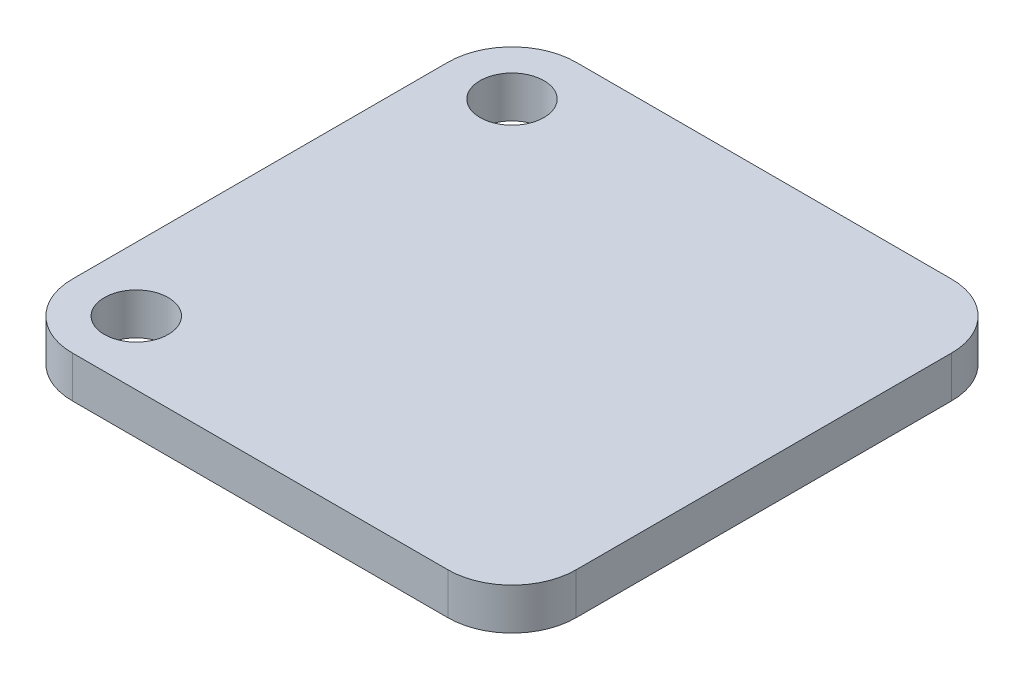
ISO-10303-21;
HEADER;
FILE_DESCRIPTION(('STEP AP214'),'2;1');
FILE_NAME('part.step','',(''),(''),'','','');
FILE_SCHEMA(('AUTOMOTIVE_DESIGN { 1 0 10303 214 1 1 1 1 }'));
ENDSEC;
DATA;
#1=APPLICATION_CONTEXT('core data for automotive mechanical design processes');
#2=APPLICATION_PROTOCOL_DEFINITION('international standard','automotive_design',2000,#1);
#3=PRODUCT_CONTEXT('',#1,'mechanical');
#4=PRODUCT('Part','Part','',(#3));
#5=PRODUCT_RELATED_PRODUCT_CATEGORY('part','',(#4));
#6=PRODUCT_DEFINITION_FORMATION('','',#4);
#7=PRODUCT_DEFINITION_CONTEXT('part definition',#1,'design');
#8=PRODUCT_DEFINITION('design','',#6,#7);
#9=PRODUCT_DEFINITION_SHAPE('','',#8);
#10=(LENGTH_UNIT() NAMED_UNIT(*) SI_UNIT(.MILLI.,.METRE.));
#11=(NAMED_UNIT(*) PLANE_ANGLE_UNIT() SI_UNIT($,.RADIAN.));
#12=(NAMED_UNIT(*) SI_UNIT($,.STERADIAN.) SOLID_ANGLE_UNIT());
#13=UNCERTAINTY_MEASURE_WITH_UNIT(LENGTH_MEASURE(1.E-05),#10,'distance_accuracy_value','');
#14=(GEOMETRIC_REPRESENTATION_CONTEXT(3) GLOBAL_UNCERTAINTY_ASSIGNED_CONTEXT((#13)) GLOBAL_UNIT_ASSIGNED_CONTEXT((#10,
#11,#12)) REPRESENTATION_CONTEXT('',''));
#15=CARTESIAN_POINT('',(0.,0.,0.));
#16=DIRECTION('',(0.,0.,1.));
#17=DIRECTION('',(1.,0.,0.));
#18=AXIS2_PLACEMENT_3D('',#15,#16,#17);
#19=CARTESIAN_POINT('',(-10.,1.65,-9.99999999999999));
#20=DIRECTION('',(1.,0.,0.));
#21=DIRECTION('',(0.,0.,-1.));
#22=AXIS2_PLACEMENT_3D('',#19,#20,#21);
#23=PLANE('',#22);
#24=DIRECTION('',(0.,0.,1.));
#25=VECTOR('',#24,1.);
#26=CARTESIAN_POINT('',(-10.,1.65,-9.99999999999999));
#27=LINE('',#26,#25);
#28=CARTESIAN_POINT('',(-10.,1.65,-7.45999999999999));
#29=VERTEX_POINT('',#28);
#30=CARTESIAN_POINT('',(-10.,1.65,7.46));
#31=VERTEX_POINT('',#30);
#32=EDGE_CURVE('E118',#29,#31,#27,.T.);
#33=ORIENTED_EDGE('',*,*,#32,.F.);
#34=DIRECTION('',(0.,-1.,0.));
#35=VECTOR('',#34,1.);
#36=CARTESIAN_POINT('',(-10.,1.65,-7.45999999999999));
#37=LINE('',#36,#35);
#38=CARTESIAN_POINT('',(-10.,0.,-7.45999999999999));
#39=VERTEX_POINT('',#38);
#40=EDGE_CURVE('E103',#29,#39,#37,.T.);
#41=ORIENTED_EDGE('',*,*,#40,.T.);
#42=DIRECTION('',(0.,0.,1.));
#43=VECTOR('',#42,1.);
#44=CARTESIAN_POINT('',(-10.,0.,-9.99999999999999));
#45=LINE('',#44,#43);
#46=CARTESIAN_POINT('',(-10.,0.,7.46));
#47=VERTEX_POINT('',#46);
#48=EDGE_CURVE('E115',#39,#47,#45,.T.);
#49=ORIENTED_EDGE('',*,*,#48,.T.);
#50=DIRECTION('',(0.,-1.,0.));
#51=VECTOR('',#50,1.);
#52=CARTESIAN_POINT('',(-10.,1.65,7.46));
#53=LINE('',#52,#51);
#54=EDGE_CURVE('E120',#47,#31,#53,.F.);
#55=ORIENTED_EDGE('',*,*,#54,.T.);
#56=EDGE_LOOP('',(#33,#41,#49,#55));
#57=FACE_BOUND('',#56,.T.);
#58=ADVANCED_FACE('F32',(#57),#23,.F.);
#59=CARTESIAN_POINT('',(10.,1.65,10.));
#60=DIRECTION('',(0.,0.,-1.));
#61=DIRECTION('',(-1.,0.,0.));
#62=AXIS2_PLACEMENT_3D('',#59,#60,#61);
#63=PLANE('',#62);
#64=DIRECTION('',(1.,0.,0.));
#65=VECTOR('',#64,1.);
#66=CARTESIAN_POINT('',(10.,1.65,10.));
#67=LINE('',#66,#65);
#68=CARTESIAN_POINT('',(-7.46,1.65,10.));
#69=VERTEX_POINT('',#68);
#70=CARTESIAN_POINT('',(7.46,1.65,10.));
#71=VERTEX_POINT('',#70);
#72=EDGE_CURVE('E162',#69,#71,#67,.T.);
#73=ORIENTED_EDGE('',*,*,#72,.F.);
#74=DIRECTION('',(0.,-1.,0.));
#75=VECTOR('',#74,1.);
#76=CARTESIAN_POINT('',(-7.46,1.65,10.));
#77=LINE('',#76,#75);
#78=CARTESIAN_POINT('',(-7.46,0.,10.));
#79=VERTEX_POINT('',#78);
#80=EDGE_CURVE('E11',#69,#79,#77,.T.);
#81=ORIENTED_EDGE('',*,*,#80,.T.);
#82=DIRECTION('',(1.,0.,0.));
#83=VECTOR('',#82,1.);
#84=CARTESIAN_POINT('',(10.,0.,10.));
#85=LINE('',#84,#83);
#86=CARTESIAN_POINT('',(7.46,0.,10.));
#87=VERTEX_POINT('',#86);
#88=EDGE_CURVE('E125',#79,#87,#85,.T.);
#89=ORIENTED_EDGE('',*,*,#88,.T.);
#90=DIRECTION('',(0.,-1.,0.));
#91=VECTOR('',#90,1.);
#92=CARTESIAN_POINT('',(7.46,1.65,10.));
#93=LINE('',#92,#91);
#94=EDGE_CURVE('E40',#87,#71,#93,.F.);
#95=ORIENTED_EDGE('',*,*,#94,.T.);
#96=EDGE_LOOP('',(#73,#81,#89,#95));
#97=FACE_BOUND('',#96,.T.);
#98=ADVANCED_FACE('F161',(#97),#63,.F.);
#99=CARTESIAN_POINT('',(10.,1.65,-10.));
#100=DIRECTION('',(-1.,0.,0.));
#101=DIRECTION('',(0.,0.,1.));
#102=AXIS2_PLACEMENT_3D('',#99,#100,#101);
#103=PLANE('',#102);
#104=DIRECTION('',(0.,0.,-1.));
#105=VECTOR('',#104,1.);
#106=CARTESIAN_POINT('',(10.,0.,-10.));
#107=LINE('',#106,#105);
#108=CARTESIAN_POINT('',(10.,0.,7.46));
#109=VERTEX_POINT('',#108);
#110=CARTESIAN_POINT('',(10.,0.,-7.46));
#111=VERTEX_POINT('',#110);
#112=EDGE_CURVE('E129',#109,#111,#107,.T.);
#113=ORIENTED_EDGE('',*,*,#112,.T.);
#114=DIRECTION('',(0.,-1.,0.));
#115=VECTOR('',#114,1.);
#116=CARTESIAN_POINT('',(10.,1.65,-7.46));
#117=LINE('',#116,#115);
#118=CARTESIAN_POINT('',(10.,1.65,-7.46));
#119=VERTEX_POINT('',#118);
#120=EDGE_CURVE('E47',#111,#119,#117,.F.);
#121=ORIENTED_EDGE('',*,*,#120,.T.);
#122=DIRECTION('',(0.,0.,-1.));
#123=VECTOR('',#122,1.);
#124=CARTESIAN_POINT('',(10.,1.65,-10.));
#125=LINE('',#124,#123);
#126=CARTESIAN_POINT('',(10.,1.65,7.46));
#127=VERTEX_POINT('',#126);
#128=EDGE_CURVE('E168',#127,#119,#125,.T.);
#129=ORIENTED_EDGE('',*,*,#128,.F.);
#130=DIRECTION('',(0.,-1.,0.));
#131=VECTOR('',#130,1.);
#132=CARTESIAN_POINT('',(10.,1.65,7.46));
#133=LINE('',#132,#131);
#134=EDGE_CURVE('E155',#127,#109,#133,.T.);
#135=ORIENTED_EDGE('',*,*,#134,.T.);
#136=EDGE_LOOP('',(#113,#121,#129,#135));
#137=FACE_BOUND('',#136,.T.);
#138=ADVANCED_FACE('F172',(#137),#103,.F.);
#139=CARTESIAN_POINT('',(10.,1.65,-10.));
#140=DIRECTION('',(0.,0.,1.));
#141=DIRECTION('',(1.,0.,0.));
#142=AXIS2_PLACEMENT_3D('',#139,#140,#141);
#143=PLANE('',#142);
#144=DIRECTION('',(-1.,0.,0.));
#145=VECTOR('',#144,1.);
#146=CARTESIAN_POINT('',(10.,0.,-10.));
#147=LINE('',#146,#145);
#148=CARTESIAN_POINT('',(7.46,0.,-10.));
#149=VERTEX_POINT('',#148);
#150=CARTESIAN_POINT('',(-7.46,0.,-9.99999999999999));
#151=VERTEX_POINT('',#150);
#152=EDGE_CURVE('E139',#149,#151,#147,.T.);
#153=ORIENTED_EDGE('',*,*,#152,.T.);
#154=DIRECTION('',(0.,-1.,0.));
#155=VECTOR('',#154,1.);
#156=CARTESIAN_POINT('',(-7.46,1.65,-9.99999999999999));
#157=LINE('',#156,#155);
#158=CARTESIAN_POINT('',(-7.46,1.65,-9.99999999999999));
#159=VERTEX_POINT('',#158);
#160=EDGE_CURVE('E104',#151,#159,#157,.F.);
#161=ORIENTED_EDGE('',*,*,#160,.T.);
#162=DIRECTION('',(-1.,0.,0.));
#163=VECTOR('',#162,1.);
#164=CARTESIAN_POINT('',(10.,1.65,-10.));
#165=LINE('',#164,#163);
#166=CARTESIAN_POINT('',(7.46,1.65,-10.));
#167=VERTEX_POINT('',#166);
#168=EDGE_CURVE('E135',#167,#159,#165,.T.);
#169=ORIENTED_EDGE('',*,*,#168,.F.);
#170=DIRECTION('',(0.,-1.,0.));
#171=VECTOR('',#170,1.);
#172=CARTESIAN_POINT('',(7.46,1.65,-10.));
#173=LINE('',#172,#171);
#174=EDGE_CURVE('E109',#167,#149,#173,.T.);
#175=ORIENTED_EDGE('',*,*,#174,.T.);
#176=EDGE_LOOP('',(#153,#161,#169,#175));
#177=FACE_BOUND('',#176,.T.);
#178=ADVANCED_FACE('F179',(#177),#143,.F.);
#179=CARTESIAN_POINT('',(0.,1.65,0.));
#180=DIRECTION('',(0.,-1.,0.));
#181=DIRECTION('',(0.,0.,-1.));
#182=AXIS2_PLACEMENT_3D('',#179,#180,#181);
#183=PLANE('',#182);
#184=CARTESIAN_POINT('',(-7.46,1.65,7.46));
#185=DIRECTION('',(0.,1.,0.));
#186=DIRECTION('',(0.,0.,1.));
#187=AXIS2_PLACEMENT_3D('',#184,#185,#186);
#188=CIRCLE('',#187,1.27);
#189=CARTESIAN_POINT('',(-7.46,1.65,8.73000000000001));
#190=VERTEX_POINT('',#189);
#191=EDGE_CURVE('E185',#190,#190,#188,.T.);
#192=ORIENTED_EDGE('',*,*,#191,.F.);
#193=EDGE_LOOP('',(#192));
#194=FACE_BOUND('',#193,.T.);
#195=CARTESIAN_POINT('',(-7.46,1.65,-7.45999999999999));
#196=DIRECTION('',(0.,1.,0.));
#197=DIRECTION('',(0.,0.,1.));
#198=AXIS2_PLACEMENT_3D('',#195,#196,#197);
#199=CIRCLE('',#198,1.27);
#200=CARTESIAN_POINT('',(-7.46,1.65,-6.18999999999999));
#201=VERTEX_POINT('',#200);
#202=EDGE_CURVE('E132',#201,#201,#199,.T.);
#203=ORIENTED_EDGE('',*,*,#202,.F.);
#204=EDGE_LOOP('',(#203));
#205=FACE_BOUND('',#204,.T.);
#206=ORIENTED_EDGE('',*,*,#168,.T.);
#207=CARTESIAN_POINT('',(-7.46,1.65,-7.45999999999999));
#208=DIRECTION('',(0.,-1.,0.));
#209=DIRECTION('',(0.,0.,-1.));
#210=AXIS2_PLACEMENT_3D('',#207,#208,#209);
#211=CIRCLE('',#210,2.54);
#212=EDGE_CURVE('E153',#159,#29,#211,.F.);
#213=ORIENTED_EDGE('',*,*,#212,.T.);
#214=ORIENTED_EDGE('',*,*,#32,.T.);
#215=CARTESIAN_POINT('',(-7.46,1.65,7.46));
#216=DIRECTION('',(0.,-1.,0.));
#217=DIRECTION('',(0.,0.,-1.));
#218=AXIS2_PLACEMENT_3D('',#215,#216,#217);
#219=CIRCLE('',#218,2.54);
#220=EDGE_CURVE('E149',#31,#69,#219,.F.);
#221=ORIENTED_EDGE('',*,*,#220,.T.);
#222=ORIENTED_EDGE('',*,*,#72,.T.);
#223=CARTESIAN_POINT('',(7.46,1.65,7.46));
#224=DIRECTION('',(0.,-1.,0.));
#225=DIRECTION('',(0.,0.,-1.));
#226=AXIS2_PLACEMENT_3D('',#223,#224,#225);
#227=CIRCLE('',#226,2.54);
#228=EDGE_CURVE('E54',#71,#127,#227,.F.);
#229=ORIENTED_EDGE('',*,*,#228,.T.);
#230=ORIENTED_EDGE('',*,*,#128,.T.);
#231=CARTESIAN_POINT('',(7.46,1.65,-7.46));
#232=DIRECTION('',(0.,-1.,0.));
#233=DIRECTION('',(0.,0.,-1.));
#234=AXIS2_PLACEMENT_3D('',#231,#232,#233);
#235=CIRCLE('',#234,2.54);
#236=EDGE_CURVE('E151',#119,#167,#235,.F.);
#237=ORIENTED_EDGE('',*,*,#236,.T.);
#238=EDGE_LOOP('',(#206,#213,#214,#221,#222,#229,#230,#237));
#239=FACE_BOUND('',#238,.T.);
#240=ADVANCED_FACE('F166',(#194,#205,#239),#183,.F.);
#241=CARTESIAN_POINT('',(0.,0.,0.));
#242=DIRECTION('',(0.,-1.,0.));
#243=DIRECTION('',(0.,0.,-1.));
#244=AXIS2_PLACEMENT_3D('',#241,#242,#243);
#245=PLANE('',#244);
#246=CARTESIAN_POINT('',(-7.46,0.,7.46));
#247=DIRECTION('',(0.,1.,0.));
#248=DIRECTION('',(0.,0.,1.));
#249=AXIS2_PLACEMENT_3D('',#246,#247,#248);
#250=CIRCLE('',#249,1.27);
#251=CARTESIAN_POINT('',(-7.46,0.,8.73000000000001));
#252=VERTEX_POINT('',#251);
#253=EDGE_CURVE('E183',#252,#252,#250,.T.);
#254=ORIENTED_EDGE('',*,*,#253,.T.);
#255=EDGE_LOOP('',(#254));
#256=FACE_BOUND('',#255,.T.);
#257=CARTESIAN_POINT('',(-7.46,0.,-7.45999999999999));
#258=DIRECTION('',(0.,1.,0.));
#259=DIRECTION('',(0.,0.,1.));
#260=AXIS2_PLACEMENT_3D('',#257,#258,#259);
#261=CIRCLE('',#260,1.27);
#262=CARTESIAN_POINT('',(-7.46,0.,-6.18999999999999));
#263=VERTEX_POINT('',#262);
#264=EDGE_CURVE('E126',#263,#263,#261,.T.);
#265=ORIENTED_EDGE('',*,*,#264,.T.);
#266=EDGE_LOOP('',(#265));
#267=FACE_BOUND('',#266,.T.);
#268=ORIENTED_EDGE('',*,*,#48,.F.);
#269=CARTESIAN_POINT('',(-7.46,0.,-7.45999999999999));
#270=DIRECTION('',(0.,-1.,0.));
#271=DIRECTION('',(0.,0.,-1.));
#272=AXIS2_PLACEMENT_3D('',#269,#270,#271);
#273=CIRCLE('',#272,2.54);
#274=EDGE_CURVE('E99',#39,#151,#273,.T.);
#275=ORIENTED_EDGE('',*,*,#274,.T.);
#276=ORIENTED_EDGE('',*,*,#152,.F.);
#277=CARTESIAN_POINT('',(7.46,0.,-7.46));
#278=DIRECTION('',(0.,-1.,0.));
#279=DIRECTION('',(0.,0.,-1.));
#280=AXIS2_PLACEMENT_3D('',#277,#278,#279);
#281=CIRCLE('',#280,2.54);
#282=EDGE_CURVE('E110',#149,#111,#281,.T.);
#283=ORIENTED_EDGE('',*,*,#282,.T.);
#284=ORIENTED_EDGE('',*,*,#112,.F.);
#285=CARTESIAN_POINT('',(7.46,0.,7.46));
#286=DIRECTION('',(0.,-1.,0.));
#287=DIRECTION('',(0.,0.,-1.));
#288=AXIS2_PLACEMENT_3D('',#285,#286,#287);
#289=CIRCLE('',#288,2.54);
#290=EDGE_CURVE('E119',#109,#87,#289,.T.);
#291=ORIENTED_EDGE('',*,*,#290,.T.);
#292=ORIENTED_EDGE('',*,*,#88,.F.);
#293=CARTESIAN_POINT('',(-7.46,0.,7.46));
#294=DIRECTION('',(0.,-1.,0.));
#295=DIRECTION('',(0.,0.,-1.));
#296=AXIS2_PLACEMENT_3D('',#293,#294,#295);
#297=CIRCLE('',#296,2.54);
#298=EDGE_CURVE('E124',#79,#47,#297,.T.);
#299=ORIENTED_EDGE('',*,*,#298,.T.);
#300=EDGE_LOOP('',(#268,#275,#276,#283,#284,#291,#292,#299));
#301=FACE_BOUND('',#300,.T.);
#302=ADVANCED_FACE('F122',(#256,#267,#301),#245,.T.);
#303=CARTESIAN_POINT('',(-7.46,1.65,-7.45999999999999));
#304=DIRECTION('',(0.,-1.,0.));
#305=DIRECTION('',(0.,0.,-1.));
#306=AXIS2_PLACEMENT_3D('',#303,#304,#305);
#307=CYLINDRICAL_SURFACE('',#306,2.54);
#308=ORIENTED_EDGE('',*,*,#212,.F.);
#309=ORIENTED_EDGE('',*,*,#160,.F.);
#310=ORIENTED_EDGE('',*,*,#274,.F.);
#311=ORIENTED_EDGE('',*,*,#40,.F.);
#312=EDGE_LOOP('',(#308,#309,#310,#311));
#313=FACE_BOUND('',#312,.T.);
#314=ADVANCED_FACE('F102',(#313),#307,.T.);
#315=CARTESIAN_POINT('',(7.46,1.65,-7.46));
#316=DIRECTION('',(0.,-1.,0.));
#317=DIRECTION('',(0.,0.,-1.));
#318=AXIS2_PLACEMENT_3D('',#315,#316,#317);
#319=CYLINDRICAL_SURFACE('',#318,2.54);
#320=ORIENTED_EDGE('',*,*,#236,.F.);
#321=ORIENTED_EDGE('',*,*,#120,.F.);
#322=ORIENTED_EDGE('',*,*,#282,.F.);
#323=ORIENTED_EDGE('',*,*,#174,.F.);
#324=EDGE_LOOP('',(#320,#321,#322,#323));
#325=FACE_BOUND('',#324,.T.);
#326=ADVANCED_FACE('F176',(#325),#319,.T.);
#327=CARTESIAN_POINT('',(-7.46,1.65,7.46));
#328=DIRECTION('',(0.,-1.,0.));
#329=DIRECTION('',(0.,0.,-1.));
#330=AXIS2_PLACEMENT_3D('',#327,#328,#329);
#331=CYLINDRICAL_SURFACE('',#330,2.54);
#332=ORIENTED_EDGE('',*,*,#220,.F.);
#333=ORIENTED_EDGE('',*,*,#54,.F.);
#334=ORIENTED_EDGE('',*,*,#298,.F.);
#335=ORIENTED_EDGE('',*,*,#80,.F.);
#336=EDGE_LOOP('',(#332,#333,#334,#335));
#337=FACE_BOUND('',#336,.T.);
#338=ADVANCED_FACE('F211',(#337),#331,.T.);
#339=CARTESIAN_POINT('',(7.46,1.65,7.46));
#340=DIRECTION('',(0.,-1.,0.));
#341=DIRECTION('',(0.,0.,-1.));
#342=AXIS2_PLACEMENT_3D('',#339,#340,#341);
#343=CYLINDRICAL_SURFACE('',#342,2.54);
#344=ORIENTED_EDGE('',*,*,#228,.F.);
#345=ORIENTED_EDGE('',*,*,#94,.F.);
#346=ORIENTED_EDGE('',*,*,#290,.F.);
#347=ORIENTED_EDGE('',*,*,#134,.F.);
#348=EDGE_LOOP('',(#344,#345,#346,#347));
#349=FACE_BOUND('',#348,.T.);
#350=ADVANCED_FACE('F34',(#349),#343,.T.);
#351=CARTESIAN_POINT('',(-7.46,0.,-7.45999999999999));
#352=DIRECTION('',(0.,1.,0.));
#353=DIRECTION('',(0.,0.,1.));
#354=AXIS2_PLACEMENT_3D('',#351,#352,#353);
#355=CYLINDRICAL_SURFACE('',#354,1.27);
#356=ORIENTED_EDGE('',*,*,#264,.F.);
#357=EDGE_LOOP('',(#356));
#358=FACE_BOUND('',#357,.T.);
#359=ORIENTED_EDGE('',*,*,#202,.T.);
#360=EDGE_LOOP('',(#359));
#361=FACE_BOUND('',#360,.T.);
#362=ADVANCED_FACE('F196',(#358,#361),#355,.F.);
#363=CARTESIAN_POINT('',(-7.46,0.,7.46));
#364=DIRECTION('',(0.,1.,0.));
#365=DIRECTION('',(0.,0.,1.));
#366=AXIS2_PLACEMENT_3D('',#363,#364,#365);
#367=CYLINDRICAL_SURFACE('',#366,1.27);
#368=ORIENTED_EDGE('',*,*,#253,.F.);
#369=EDGE_LOOP('',(#368));
#370=FACE_BOUND('',#369,.T.);
#371=ORIENTED_EDGE('',*,*,#191,.T.);
#372=EDGE_LOOP('',(#371));
#373=FACE_BOUND('',#372,.T.);
#374=ADVANCED_FACE('F193',(#370,#373),#367,.F.);
#375=CLOSED_SHELL('',(#58,#98,#138,#178,#240,#302,#314,#326,#338,#350,#362,#374));
#376=MANIFOLD_SOLID_BREP('B2',#375);
#377=ADVANCED_BREP_SHAPE_REPRESENTATION('',(#18,#376),#14);
#378=SHAPE_DEFINITION_REPRESENTATION(#9,#377);
ENDSEC;
END-ISO-10303-21;
